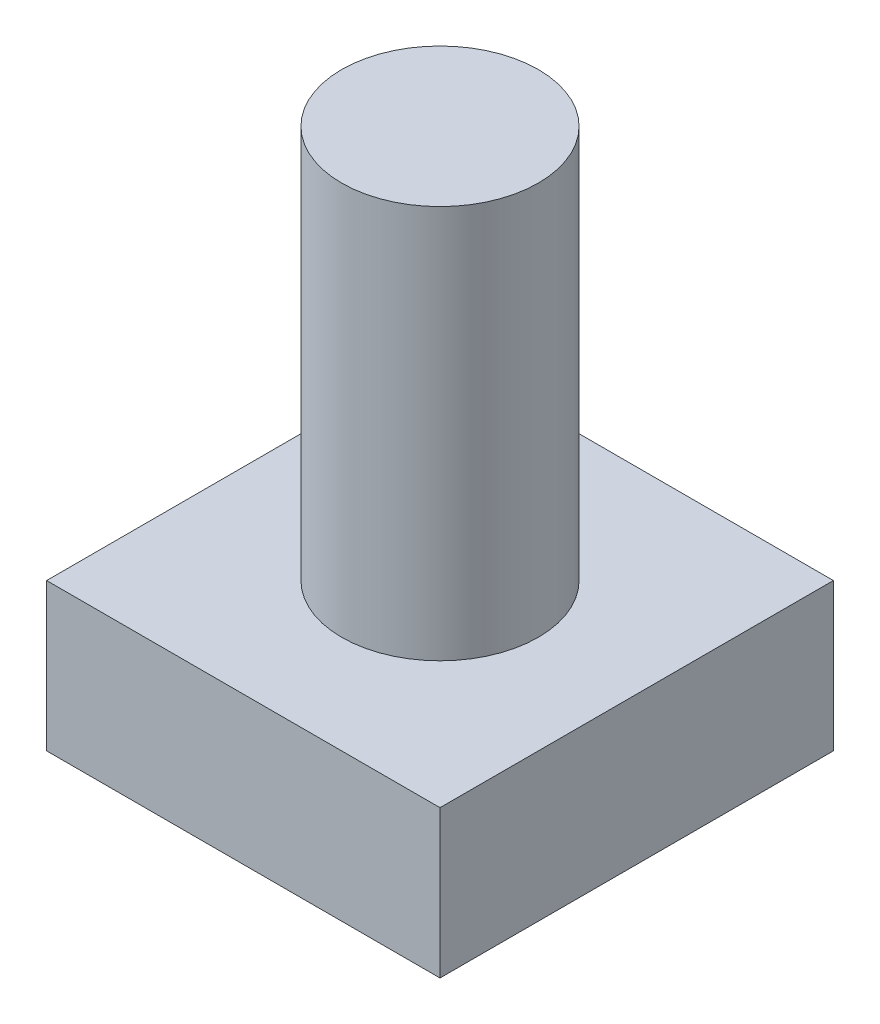
ISO-10303-21;
HEADER;
FILE_DESCRIPTION(('STEP AP214'),'2;1');
FILE_NAME('part.step','',(''),(''),'','','');
FILE_SCHEMA(('AUTOMOTIVE_DESIGN { 1 0 10303 214 1 1 1 1 }'));
ENDSEC;
DATA;
#1=APPLICATION_CONTEXT('core data for automotive mechanical design processes');
#2=APPLICATION_PROTOCOL_DEFINITION('international standard','automotive_design',2000,#1);
#3=PRODUCT_CONTEXT('',#1,'mechanical');
#4=PRODUCT('Part','Part','',(#3));
#5=PRODUCT_RELATED_PRODUCT_CATEGORY('part','',(#4));
#6=PRODUCT_DEFINITION_FORMATION('','',#4);
#7=PRODUCT_DEFINITION_CONTEXT('part definition',#1,'design');
#8=PRODUCT_DEFINITION('design','',#6,#7);
#9=PRODUCT_DEFINITION_SHAPE('','',#8);
#10=(LENGTH_UNIT() NAMED_UNIT(*) SI_UNIT(.MILLI.,.METRE.));
#11=(NAMED_UNIT(*) PLANE_ANGLE_UNIT() SI_UNIT($,.RADIAN.));
#12=(NAMED_UNIT(*) SI_UNIT($,.STERADIAN.) SOLID_ANGLE_UNIT());
#13=UNCERTAINTY_MEASURE_WITH_UNIT(LENGTH_MEASURE(1.E-05),#10,'distance_accuracy_value','');
#14=(GEOMETRIC_REPRESENTATION_CONTEXT(3) GLOBAL_UNCERTAINTY_ASSIGNED_CONTEXT((#13)) GLOBAL_UNIT_ASSIGNED_CONTEXT((#10,
#11,#12)) REPRESENTATION_CONTEXT('',''));
#15=CARTESIAN_POINT('',(0.,0.,0.));
#16=DIRECTION('',(0.,0.,1.));
#17=DIRECTION('',(1.,0.,0.));
#18=AXIS2_PLACEMENT_3D('',#15,#16,#17);
#19=CARTESIAN_POINT('',(2.,0.75,4.));
#20=DIRECTION('',(-1.,0.,0.));
#21=DIRECTION('',(0.,-1.,0.));
#22=AXIS2_PLACEMENT_3D('',#19,#20,#21);
#23=PLANE('',#22);
#24=DIRECTION('',(0.,1.,0.));
#25=VECTOR('',#24,1.);
#26=CARTESIAN_POINT('',(2.,0.75,0.));
#27=LINE('',#26,#25);
#28=CARTESIAN_POINT('',(2.,-0.75,0.));
#29=VERTEX_POINT('',#28);
#30=CARTESIAN_POINT('',(2.,0.75,0.));
#31=VERTEX_POINT('',#30);
#32=EDGE_CURVE('E103',#29,#31,#27,.T.);
#33=ORIENTED_EDGE('',*,*,#32,.T.);
#34=DIRECTION('',(0.,0.,-1.));
#35=VECTOR('',#34,1.);
#36=CARTESIAN_POINT('',(2.,0.75,4.));
#37=LINE('',#36,#35);
#38=CARTESIAN_POINT('',(2.,0.75,4.));
#39=VERTEX_POINT('',#38);
#40=EDGE_CURVE('E40',#39,#31,#37,.T.);
#41=ORIENTED_EDGE('',*,*,#40,.F.);
#42=DIRECTION('',(0.,1.,0.));
#43=VECTOR('',#42,1.);
#44=CARTESIAN_POINT('',(2.,0.75,4.));
#45=LINE('',#44,#43);
#46=CARTESIAN_POINT('',(2.,-0.75,4.));
#47=VERTEX_POINT('',#46);
#48=EDGE_CURVE('E90',#47,#39,#45,.T.);
#49=ORIENTED_EDGE('',*,*,#48,.F.);
#50=DIRECTION('',(0.,0.,-1.));
#51=VECTOR('',#50,1.);
#52=CARTESIAN_POINT('',(2.,-0.75,4.));
#53=LINE('',#52,#51);
#54=EDGE_CURVE('E99',#47,#29,#53,.T.);
#55=ORIENTED_EDGE('',*,*,#54,.T.);
#56=EDGE_LOOP('',(#33,#41,#49,#55));
#57=FACE_BOUND('',#56,.T.);
#58=ADVANCED_FACE('F37',(#57),#23,.F.);
#59=CARTESIAN_POINT('',(-2.,0.75,4.));
#60=DIRECTION('',(0.,-1.,0.));
#61=DIRECTION('',(0.,0.,-1.));
#62=AXIS2_PLACEMENT_3D('',#59,#60,#61);
#63=PLANE('',#62);
#64=CARTESIAN_POINT('',(0.,0.75,2.));
#65=DIRECTION('',(0.,1.,0.));
#66=DIRECTION('',(0.,0.,1.));
#67=AXIS2_PLACEMENT_3D('',#64,#65,#66);
#68=CIRCLE('',#67,1.);
#69=CARTESIAN_POINT('',(0.,0.75,3.));
#70=VERTEX_POINT('',#69);
#71=EDGE_CURVE('E11',#70,#70,#68,.T.);
#72=ORIENTED_EDGE('',*,*,#71,.F.);
#73=EDGE_LOOP('',(#72));
#74=FACE_BOUND('',#73,.T.);
#75=DIRECTION('',(-1.,0.,0.));
#76=VECTOR('',#75,1.);
#77=CARTESIAN_POINT('',(-2.,0.75,0.));
#78=LINE('',#77,#76);
#79=CARTESIAN_POINT('',(-2.,0.75,0.));
#80=VERTEX_POINT('',#79);
#81=EDGE_CURVE('E95',#31,#80,#78,.T.);
#82=ORIENTED_EDGE('',*,*,#81,.T.);
#83=DIRECTION('',(0.,0.,-1.));
#84=VECTOR('',#83,1.);
#85=CARTESIAN_POINT('',(-2.,0.75,4.));
#86=LINE('',#85,#84);
#87=CARTESIAN_POINT('',(-2.,0.75,4.));
#88=VERTEX_POINT('',#87);
#89=EDGE_CURVE('E93',#88,#80,#86,.T.);
#90=ORIENTED_EDGE('',*,*,#89,.F.);
#91=DIRECTION('',(-1.,0.,0.));
#92=VECTOR('',#91,1.);
#93=CARTESIAN_POINT('',(-2.,0.75,4.));
#94=LINE('',#93,#92);
#95=EDGE_CURVE('E85',#39,#88,#94,.T.);
#96=ORIENTED_EDGE('',*,*,#95,.F.);
#97=ORIENTED_EDGE('',*,*,#40,.T.);
#98=EDGE_LOOP('',(#82,#90,#96,#97));
#99=FACE_BOUND('',#98,.T.);
#100=ADVANCED_FACE('F94',(#74,#99),#63,.F.);
#101=CARTESIAN_POINT('',(-2.,0.75,4.));
#102=DIRECTION('',(1.,0.,0.));
#103=DIRECTION('',(0.,0.,-1.));
#104=AXIS2_PLACEMENT_3D('',#101,#102,#103);
#105=PLANE('',#104);
#106=DIRECTION('',(0.,-1.,0.));
#107=VECTOR('',#106,1.);
#108=CARTESIAN_POINT('',(-2.,0.75,0.));
#109=LINE('',#108,#107);
#110=CARTESIAN_POINT('',(-2.,-0.75,0.));
#111=VERTEX_POINT('',#110);
#112=EDGE_CURVE('E71',#80,#111,#109,.T.);
#113=ORIENTED_EDGE('',*,*,#112,.T.);
#114=DIRECTION('',(0.,0.,-1.));
#115=VECTOR('',#114,1.);
#116=CARTESIAN_POINT('',(-2.,-0.75,4.));
#117=LINE('',#116,#115);
#118=CARTESIAN_POINT('',(-2.,-0.75,4.));
#119=VERTEX_POINT('',#118);
#120=EDGE_CURVE('E96',#119,#111,#117,.T.);
#121=ORIENTED_EDGE('',*,*,#120,.F.);
#122=DIRECTION('',(0.,-1.,0.));
#123=VECTOR('',#122,1.);
#124=CARTESIAN_POINT('',(-2.,0.75,4.));
#125=LINE('',#124,#123);
#126=EDGE_CURVE('E88',#88,#119,#125,.T.);
#127=ORIENTED_EDGE('',*,*,#126,.F.);
#128=ORIENTED_EDGE('',*,*,#89,.T.);
#129=EDGE_LOOP('',(#113,#121,#127,#128));
#130=FACE_BOUND('',#129,.T.);
#131=ADVANCED_FACE('F97',(#130),#105,.F.);
#132=CARTESIAN_POINT('',(-2.,-0.75,4.));
#133=DIRECTION('',(0.,1.,0.));
#134=DIRECTION('',(0.,0.,1.));
#135=AXIS2_PLACEMENT_3D('',#132,#133,#134);
#136=PLANE('',#135);
#137=DIRECTION('',(1.,0.,0.));
#138=VECTOR('',#137,1.);
#139=CARTESIAN_POINT('',(-2.,-0.75,0.));
#140=LINE('',#139,#138);
#141=EDGE_CURVE('E77',#111,#29,#140,.T.);
#142=ORIENTED_EDGE('',*,*,#141,.T.);
#143=ORIENTED_EDGE('',*,*,#54,.F.);
#144=DIRECTION('',(1.,0.,0.));
#145=VECTOR('',#144,1.);
#146=CARTESIAN_POINT('',(-2.,-0.75,4.));
#147=LINE('',#146,#145);
#148=EDGE_CURVE('E54',#119,#47,#147,.T.);
#149=ORIENTED_EDGE('',*,*,#148,.F.);
#150=ORIENTED_EDGE('',*,*,#120,.T.);
#151=EDGE_LOOP('',(#142,#143,#149,#150));
#152=FACE_BOUND('',#151,.T.);
#153=ADVANCED_FACE('F111',(#152),#136,.F.);
#154=CARTESIAN_POINT('',(0.,0.,4.));
#155=DIRECTION('',(0.,0.,1.));
#156=DIRECTION('',(1.,0.,0.));
#157=AXIS2_PLACEMENT_3D('',#154,#155,#156);
#158=PLANE('',#157);
#159=ORIENTED_EDGE('',*,*,#48,.T.);
#160=ORIENTED_EDGE('',*,*,#95,.T.);
#161=ORIENTED_EDGE('',*,*,#126,.T.);
#162=ORIENTED_EDGE('',*,*,#148,.T.);
#163=EDGE_LOOP('',(#159,#160,#161,#162));
#164=FACE_BOUND('',#163,.T.);
#165=ADVANCED_FACE('F86',(#164),#158,.T.);
#166=CARTESIAN_POINT('',(0.,0.,0.));
#167=DIRECTION('',(0.,0.,1.));
#168=DIRECTION('',(1.,0.,0.));
#169=AXIS2_PLACEMENT_3D('',#166,#167,#168);
#170=PLANE('',#169);
#171=ORIENTED_EDGE('',*,*,#32,.F.);
#172=ORIENTED_EDGE('',*,*,#141,.F.);
#173=ORIENTED_EDGE('',*,*,#112,.F.);
#174=ORIENTED_EDGE('',*,*,#81,.F.);
#175=EDGE_LOOP('',(#171,#172,#173,#174));
#176=FACE_BOUND('',#175,.T.);
#177=ADVANCED_FACE('F114',(#176),#170,.F.);
#178=CARTESIAN_POINT('',(0.,4.75,2.));
#179=DIRECTION('',(0.,-1.,0.));
#180=DIRECTION('',(0.,0.,-1.));
#181=AXIS2_PLACEMENT_3D('',#178,#179,#180);
#182=CYLINDRICAL_SURFACE('',#181,1.);
#183=CARTESIAN_POINT('',(0.,4.75,2.));
#184=DIRECTION('',(0.,1.,0.));
#185=DIRECTION('',(0.,0.,1.));
#186=AXIS2_PLACEMENT_3D('',#183,#184,#185);
#187=CIRCLE('',#186,1.);
#188=CARTESIAN_POINT('',(0.,4.75,3.));
#189=VERTEX_POINT('',#188);
#190=EDGE_CURVE('E106',#189,#189,#187,.T.);
#191=ORIENTED_EDGE('',*,*,#190,.F.);
#192=EDGE_LOOP('',(#191));
#193=FACE_BOUND('',#192,.T.);
#194=ORIENTED_EDGE('',*,*,#71,.T.);
#195=EDGE_LOOP('',(#194));
#196=FACE_BOUND('',#195,.T.);
#197=ADVANCED_FACE('F122',(#193,#196),#182,.T.);
#198=CARTESIAN_POINT('',(0.,4.75,2.));
#199=DIRECTION('',(0.,1.,0.));
#200=DIRECTION('',(0.,0.,1.));
#201=AXIS2_PLACEMENT_3D('',#198,#199,#200);
#202=PLANE('',#201);
#203=ORIENTED_EDGE('',*,*,#190,.T.);
#204=EDGE_LOOP('',(#203));
#205=FACE_BOUND('',#204,.T.);
#206=ADVANCED_FACE('F120',(#205),#202,.T.);
#207=CLOSED_SHELL('',(#58,#100,#131,#153,#165,#177,#197,#206));
#208=MANIFOLD_SOLID_BREP('B2',#207);
#209=ADVANCED_BREP_SHAPE_REPRESENTATION('',(#18,#208),#14);
#210=SHAPE_DEFINITION_REPRESENTATION(#9,#209);
ENDSEC;
END-ISO-10303-21;
